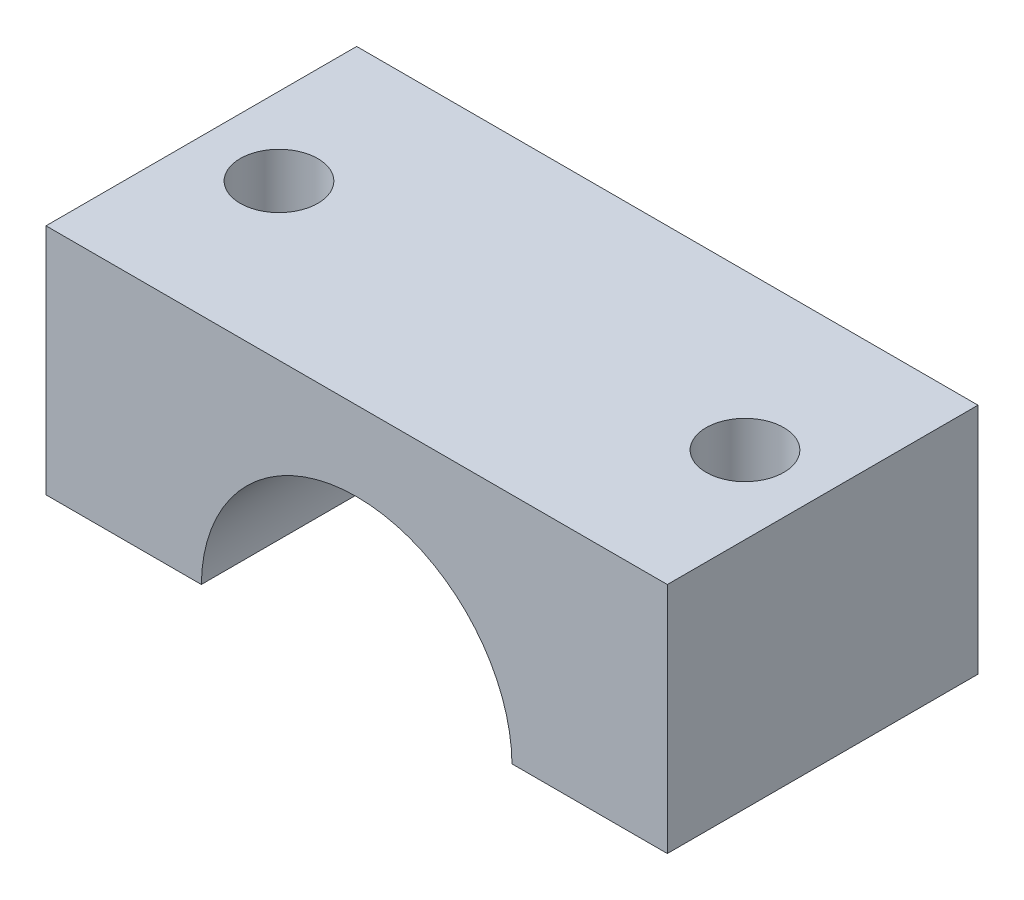
ISO-10303-21;
HEADER;
FILE_DESCRIPTION(('STEP AP214'),'2;1');
FILE_NAME('part.step','',(''),(''),'','','');
FILE_SCHEMA(('AUTOMOTIVE_DESIGN { 1 0 10303 214 1 1 1 1 }'));
ENDSEC;
DATA;
#1=APPLICATION_CONTEXT('core data for automotive mechanical design processes');
#2=APPLICATION_PROTOCOL_DEFINITION('international standard','automotive_design',2000,#1);
#3=PRODUCT_CONTEXT('',#1,'mechanical');
#4=PRODUCT('Part','Part','',(#3));
#5=PRODUCT_RELATED_PRODUCT_CATEGORY('part','',(#4));
#6=PRODUCT_DEFINITION_FORMATION('','',#4);
#7=PRODUCT_DEFINITION_CONTEXT('part definition',#1,'design');
#8=PRODUCT_DEFINITION('design','',#6,#7);
#9=PRODUCT_DEFINITION_SHAPE('','',#8);
#10=(LENGTH_UNIT() NAMED_UNIT(*) SI_UNIT(.MILLI.,.METRE.));
#11=(NAMED_UNIT(*) PLANE_ANGLE_UNIT() SI_UNIT($,.RADIAN.));
#12=(NAMED_UNIT(*) SI_UNIT($,.STERADIAN.) SOLID_ANGLE_UNIT());
#13=UNCERTAINTY_MEASURE_WITH_UNIT(LENGTH_MEASURE(1.E-05),#10,'distance_accuracy_value','');
#14=(GEOMETRIC_REPRESENTATION_CONTEXT(3) GLOBAL_UNCERTAINTY_ASSIGNED_CONTEXT((#13)) GLOBAL_UNIT_ASSIGNED_CONTEXT((#10,
#11,#12)) REPRESENTATION_CONTEXT('',''));
#15=CARTESIAN_POINT('',(0.,0.,0.));
#16=DIRECTION('',(0.,0.,1.));
#17=DIRECTION('',(1.,0.,0.));
#18=AXIS2_PLACEMENT_3D('',#15,#16,#17);
#19=CARTESIAN_POINT('',(0.,0.,0.));
#20=DIRECTION('',(0.,-1.,0.));
#21=DIRECTION('',(0.,0.,-1.));
#22=AXIS2_PLACEMENT_3D('',#19,#20,#21);
#23=PLANE('',#22);
#24=CARTESIAN_POINT('',(19.05,0.,0.));
#25=DIRECTION('',(0.,1.,0.));
#26=DIRECTION('',(0.,0.,1.));
#27=AXIS2_PLACEMENT_3D('',#24,#25,#26);
#28=CIRCLE('',#27,3.175);
#29=CARTESIAN_POINT('',(19.05,0.,3.175));
#30=VERTEX_POINT('',#29);
#31=EDGE_CURVE('E104',#30,#30,#28,.T.);
#32=ORIENTED_EDGE('',*,*,#31,.T.);
#33=EDGE_LOOP('',(#32));
#34=FACE_BOUND('',#33,.T.);
#35=DIRECTION('',(0.,0.,1.));
#36=VECTOR('',#35,1.);
#37=CARTESIAN_POINT('',(12.6993649841242,0.,-12.7));
#38=LINE('',#37,#36);
#39=CARTESIAN_POINT('',(12.6993649841242,0.,-12.7));
#40=VERTEX_POINT('',#39);
#41=CARTESIAN_POINT('',(12.6993649841242,0.,12.7));
#42=VERTEX_POINT('',#41);
#43=EDGE_CURVE('E11',#40,#42,#38,.T.);
#44=ORIENTED_EDGE('',*,*,#43,.F.);
#45=DIRECTION('',(-1.,0.,0.));
#46=VECTOR('',#45,1.);
#47=CARTESIAN_POINT('',(-25.4,0.,-12.7));
#48=LINE('',#47,#46);
#49=CARTESIAN_POINT('',(25.4,0.,-12.7));
#50=VERTEX_POINT('',#49);
#51=EDGE_CURVE('E112',#50,#40,#48,.T.);
#52=ORIENTED_EDGE('',*,*,#51,.F.);
#53=DIRECTION('',(0.,0.,-1.));
#54=VECTOR('',#53,1.);
#55=CARTESIAN_POINT('',(25.4,0.,12.7));
#56=LINE('',#55,#54);
#57=CARTESIAN_POINT('',(25.4,0.,12.7));
#58=VERTEX_POINT('',#57);
#59=EDGE_CURVE('E108',#58,#50,#56,.T.);
#60=ORIENTED_EDGE('',*,*,#59,.F.);
#61=DIRECTION('',(1.,0.,0.));
#62=VECTOR('',#61,1.);
#63=CARTESIAN_POINT('',(-25.4,0.,12.7));
#64=LINE('',#63,#62);
#65=EDGE_CURVE('E78',#42,#58,#64,.T.);
#66=ORIENTED_EDGE('',*,*,#65,.F.);
#67=EDGE_LOOP('',(#44,#52,#60,#66));
#68=FACE_BOUND('',#67,.T.);
#69=ADVANCED_FACE('F35',(#34,#68),#23,.T.);
#70=CARTESIAN_POINT('',(25.4,19.05,12.7));
#71=DIRECTION('',(-1.,0.,0.));
#72=DIRECTION('',(0.,0.,1.));
#73=AXIS2_PLACEMENT_3D('',#70,#71,#72);
#74=PLANE('',#73);
#75=ORIENTED_EDGE('',*,*,#59,.T.);
#76=DIRECTION('',(0.,-1.,0.));
#77=VECTOR('',#76,1.);
#78=CARTESIAN_POINT('',(25.4,19.05,-12.7));
#79=LINE('',#78,#77);
#80=CARTESIAN_POINT('',(25.4,19.05,-12.7));
#81=VERTEX_POINT('',#80);
#82=EDGE_CURVE('E123',#81,#50,#79,.T.);
#83=ORIENTED_EDGE('',*,*,#82,.F.);
#84=DIRECTION('',(0.,0.,-1.));
#85=VECTOR('',#84,1.);
#86=CARTESIAN_POINT('',(25.4,19.05,12.7));
#87=LINE('',#86,#85);
#88=CARTESIAN_POINT('',(25.4,19.05,12.7));
#89=VERTEX_POINT('',#88);
#90=EDGE_CURVE('E111',#89,#81,#87,.T.);
#91=ORIENTED_EDGE('',*,*,#90,.F.);
#92=DIRECTION('',(0.,-1.,0.));
#93=VECTOR('',#92,1.);
#94=CARTESIAN_POINT('',(25.4,19.05,12.7));
#95=LINE('',#94,#93);
#96=EDGE_CURVE('E116',#89,#58,#95,.T.);
#97=ORIENTED_EDGE('',*,*,#96,.T.);
#98=EDGE_LOOP('',(#75,#83,#91,#97));
#99=FACE_BOUND('',#98,.T.);
#100=ADVANCED_FACE('F37',(#99),#74,.F.);
#101=CARTESIAN_POINT('',(-25.4,19.05,-12.7));
#102=DIRECTION('',(0.,0.,1.));
#103=DIRECTION('',(1.,0.,0.));
#104=AXIS2_PLACEMENT_3D('',#101,#102,#103);
#105=PLANE('',#104);
#106=ORIENTED_EDGE('',*,*,#51,.T.);
#107=CARTESIAN_POINT('',(0.,-0.127,-12.7));
#108=DIRECTION('',(0.,0.,1.));
#109=DIRECTION('',(1.,0.,0.));
#110=AXIS2_PLACEMENT_3D('',#107,#108,#109);
#111=CIRCLE('',#110,12.7);
#112=CARTESIAN_POINT('',(-12.6993649841242,0.,-12.7));
#113=VERTEX_POINT('',#112);
#114=EDGE_CURVE('E96',#40,#113,#111,.T.);
#115=ORIENTED_EDGE('',*,*,#114,.T.);
#116=CARTESIAN_POINT('',(-25.4,0.,-12.7));
#117=VERTEX_POINT('',#116);
#118=EDGE_CURVE('E127',#113,#117,#48,.T.);
#119=ORIENTED_EDGE('',*,*,#118,.T.);
#120=DIRECTION('',(0.,-1.,0.));
#121=VECTOR('',#120,1.);
#122=CARTESIAN_POINT('',(-25.4,19.05,-12.7));
#123=LINE('',#122,#121);
#124=CARTESIAN_POINT('',(-25.4,19.05,-12.7));
#125=VERTEX_POINT('',#124);
#126=EDGE_CURVE('E120',#125,#117,#123,.T.);
#127=ORIENTED_EDGE('',*,*,#126,.F.);
#128=DIRECTION('',(-1.,0.,0.));
#129=VECTOR('',#128,1.);
#130=CARTESIAN_POINT('',(-25.4,19.05,-12.7));
#131=LINE('',#130,#129);
#132=EDGE_CURVE('E86',#81,#125,#131,.T.);
#133=ORIENTED_EDGE('',*,*,#132,.F.);
#134=ORIENTED_EDGE('',*,*,#82,.T.);
#135=EDGE_LOOP('',(#106,#115,#119,#127,#133,#134));
#136=FACE_BOUND('',#135,.T.);
#137=ADVANCED_FACE('F126',(#136),#105,.F.);
#138=CARTESIAN_POINT('',(-25.4,19.05,12.7));
#139=DIRECTION('',(1.,0.,0.));
#140=DIRECTION('',(0.,0.,-1.));
#141=AXIS2_PLACEMENT_3D('',#138,#139,#140);
#142=PLANE('',#141);
#143=DIRECTION('',(0.,0.,1.));
#144=VECTOR('',#143,1.);
#145=CARTESIAN_POINT('',(-25.4,0.,12.7));
#146=LINE('',#145,#144);
#147=CARTESIAN_POINT('',(-25.4,0.,12.7));
#148=VERTEX_POINT('',#147);
#149=EDGE_CURVE('E109',#117,#148,#146,.T.);
#150=ORIENTED_EDGE('',*,*,#149,.T.);
#151=DIRECTION('',(0.,-1.,0.));
#152=VECTOR('',#151,1.);
#153=CARTESIAN_POINT('',(-25.4,19.05,12.7));
#154=LINE('',#153,#152);
#155=CARTESIAN_POINT('',(-25.4,19.05,12.7));
#156=VERTEX_POINT('',#155);
#157=EDGE_CURVE('E118',#156,#148,#154,.T.);
#158=ORIENTED_EDGE('',*,*,#157,.F.);
#159=DIRECTION('',(0.,0.,1.));
#160=VECTOR('',#159,1.);
#161=CARTESIAN_POINT('',(-25.4,19.05,12.7));
#162=LINE('',#161,#160);
#163=EDGE_CURVE('E134',#125,#156,#162,.T.);
#164=ORIENTED_EDGE('',*,*,#163,.F.);
#165=ORIENTED_EDGE('',*,*,#126,.T.);
#166=EDGE_LOOP('',(#150,#158,#164,#165));
#167=FACE_BOUND('',#166,.T.);
#168=ADVANCED_FACE('F163',(#167),#142,.F.);
#169=CARTESIAN_POINT('',(-25.4,19.05,12.7));
#170=DIRECTION('',(0.,0.,-1.));
#171=DIRECTION('',(-1.,0.,0.));
#172=AXIS2_PLACEMENT_3D('',#169,#170,#171);
#173=PLANE('',#172);
#174=CARTESIAN_POINT('',(-12.6993649841242,0.,12.7));
#175=VERTEX_POINT('',#174);
#176=EDGE_CURVE('E103',#148,#175,#64,.T.);
#177=ORIENTED_EDGE('',*,*,#176,.T.);
#178=CARTESIAN_POINT('',(0.,-0.127,12.7));
#179=DIRECTION('',(0.,0.,1.));
#180=DIRECTION('',(1.,0.,0.));
#181=AXIS2_PLACEMENT_3D('',#178,#179,#180);
#182=CIRCLE('',#181,12.7);
#183=EDGE_CURVE('E49',#42,#175,#182,.T.);
#184=ORIENTED_EDGE('',*,*,#183,.F.);
#185=ORIENTED_EDGE('',*,*,#65,.T.);
#186=ORIENTED_EDGE('',*,*,#96,.F.);
#187=DIRECTION('',(1.,0.,0.));
#188=VECTOR('',#187,1.);
#189=CARTESIAN_POINT('',(-25.4,19.05,12.7));
#190=LINE('',#189,#188);
#191=EDGE_CURVE('E58',#156,#89,#190,.T.);
#192=ORIENTED_EDGE('',*,*,#191,.F.);
#193=ORIENTED_EDGE('',*,*,#157,.T.);
#194=EDGE_LOOP('',(#177,#184,#185,#186,#192,#193));
#195=FACE_BOUND('',#194,.T.);
#196=ADVANCED_FACE('F100',(#195),#173,.F.);
#197=CARTESIAN_POINT('',(0.,19.05,0.));
#198=DIRECTION('',(0.,-1.,0.));
#199=DIRECTION('',(0.,0.,-1.));
#200=AXIS2_PLACEMENT_3D('',#197,#198,#199);
#201=PLANE('',#200);
#202=CARTESIAN_POINT('',(-19.05,19.05,0.));
#203=DIRECTION('',(0.,1.,0.));
#204=DIRECTION('',(0.,0.,1.));
#205=AXIS2_PLACEMENT_3D('',#202,#203,#204);
#206=CIRCLE('',#205,3.175);
#207=CARTESIAN_POINT('',(-19.05,19.05,3.175));
#208=VERTEX_POINT('',#207);
#209=EDGE_CURVE('E146',#208,#208,#206,.T.);
#210=ORIENTED_EDGE('',*,*,#209,.F.);
#211=EDGE_LOOP('',(#210));
#212=FACE_BOUND('',#211,.T.);
#213=CARTESIAN_POINT('',(19.05,19.05,0.));
#214=DIRECTION('',(0.,1.,0.));
#215=DIRECTION('',(0.,0.,1.));
#216=AXIS2_PLACEMENT_3D('',#213,#214,#215);
#217=CIRCLE('',#216,3.175);
#218=CARTESIAN_POINT('',(19.05,19.05,3.175));
#219=VERTEX_POINT('',#218);
#220=EDGE_CURVE('E140',#219,#219,#217,.T.);
#221=ORIENTED_EDGE('',*,*,#220,.F.);
#222=EDGE_LOOP('',(#221));
#223=FACE_BOUND('',#222,.T.);
#224=ORIENTED_EDGE('',*,*,#90,.T.);
#225=ORIENTED_EDGE('',*,*,#132,.T.);
#226=ORIENTED_EDGE('',*,*,#163,.T.);
#227=ORIENTED_EDGE('',*,*,#191,.T.);
#228=EDGE_LOOP('',(#224,#225,#226,#227));
#229=FACE_BOUND('',#228,.T.);
#230=ADVANCED_FACE('F152',(#212,#223,#229),#201,.F.);
#231=CARTESIAN_POINT('',(-19.05,0.,0.));
#232=DIRECTION('',(0.,1.,0.));
#233=DIRECTION('',(0.,0.,1.));
#234=AXIS2_PLACEMENT_3D('',#231,#232,#233);
#235=CIRCLE('',#234,3.175);
#236=CARTESIAN_POINT('',(-19.05,0.,3.175));
#237=VERTEX_POINT('',#236);
#238=EDGE_CURVE('E143',#237,#237,#235,.T.);
#239=ORIENTED_EDGE('',*,*,#238,.T.);
#240=EDGE_LOOP('',(#239));
#241=FACE_BOUND('',#240,.T.);
#242=DIRECTION('',(0.,0.,1.));
#243=VECTOR('',#242,1.);
#244=CARTESIAN_POINT('',(-12.6993649841242,0.,-12.7));
#245=LINE('',#244,#243);
#246=EDGE_CURVE('E43',#175,#113,#245,.F.);
#247=ORIENTED_EDGE('',*,*,#246,.F.);
#248=ORIENTED_EDGE('',*,*,#176,.F.);
#249=ORIENTED_EDGE('',*,*,#149,.F.);
#250=ORIENTED_EDGE('',*,*,#118,.F.);
#251=EDGE_LOOP('',(#247,#248,#249,#250));
#252=FACE_BOUND('',#251,.T.);
#253=ADVANCED_FACE('F130',(#241,#252),#23,.T.);
#254=CARTESIAN_POINT('',(0.,-0.127,-12.7));
#255=DIRECTION('',(0.,0.,1.));
#256=DIRECTION('',(1.,0.,0.));
#257=AXIS2_PLACEMENT_3D('',#254,#255,#256);
#258=CYLINDRICAL_SURFACE('',#257,12.7);
#259=ORIENTED_EDGE('',*,*,#43,.T.);
#260=ORIENTED_EDGE('',*,*,#183,.T.);
#261=ORIENTED_EDGE('',*,*,#246,.T.);
#262=ORIENTED_EDGE('',*,*,#114,.F.);
#263=EDGE_LOOP('',(#259,#260,#261,#262));
#264=FACE_BOUND('',#263,.T.);
#265=ADVANCED_FACE('F94',(#264),#258,.F.);
#266=CARTESIAN_POINT('',(19.05,19.05,0.));
#267=DIRECTION('',(0.,1.,0.));
#268=DIRECTION('',(0.,0.,1.));
#269=AXIS2_PLACEMENT_3D('',#266,#267,#268);
#270=CYLINDRICAL_SURFACE('',#269,3.175);
#271=ORIENTED_EDGE('',*,*,#31,.F.);
#272=EDGE_LOOP('',(#271));
#273=FACE_BOUND('',#272,.T.);
#274=ORIENTED_EDGE('',*,*,#220,.T.);
#275=EDGE_LOOP('',(#274));
#276=FACE_BOUND('',#275,.T.);
#277=ADVANCED_FACE('F182',(#273,#276),#270,.F.);
#278=CARTESIAN_POINT('',(-19.05,19.05,0.));
#279=DIRECTION('',(0.,1.,0.));
#280=DIRECTION('',(0.,0.,1.));
#281=AXIS2_PLACEMENT_3D('',#278,#279,#280);
#282=CYLINDRICAL_SURFACE('',#281,3.175);
#283=ORIENTED_EDGE('',*,*,#238,.F.);
#284=EDGE_LOOP('',(#283));
#285=FACE_BOUND('',#284,.T.);
#286=ORIENTED_EDGE('',*,*,#209,.T.);
#287=EDGE_LOOP('',(#286));
#288=FACE_BOUND('',#287,.T.);
#289=ADVANCED_FACE('F150',(#285,#288),#282,.F.);
#290=CLOSED_SHELL('',(#69,#100,#137,#168,#196,#230,#253,#265,#277,#289));
#291=MANIFOLD_SOLID_BREP('B2',#290);
#292=ADVANCED_BREP_SHAPE_REPRESENTATION('',(#18,#291),#14);
#293=SHAPE_DEFINITION_REPRESENTATION(#9,#292);
ENDSEC;
END-ISO-10303-21;
